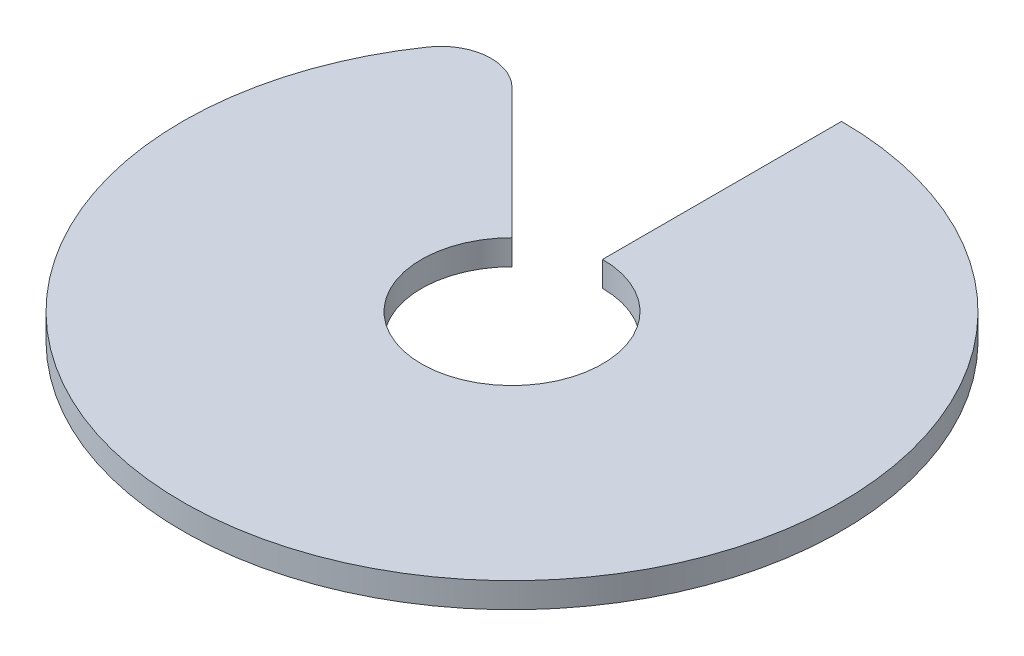
ISO-10303-21;
HEADER;
FILE_DESCRIPTION(('STEP AP214'),'2;1');
FILE_NAME('part.step','',(''),(''),'','','');
FILE_SCHEMA(('AUTOMOTIVE_DESIGN { 1 0 10303 214 1 1 1 1 }'));
ENDSEC;
DATA;
#1=APPLICATION_CONTEXT('core data for automotive mechanical design processes');
#2=APPLICATION_PROTOCOL_DEFINITION('international standard','automotive_design',2000,#1);
#3=PRODUCT_CONTEXT('',#1,'mechanical');
#4=PRODUCT('Part','Part','',(#3));
#5=PRODUCT_RELATED_PRODUCT_CATEGORY('part','',(#4));
#6=PRODUCT_DEFINITION_FORMATION('','',#4);
#7=PRODUCT_DEFINITION_CONTEXT('part definition',#1,'design');
#8=PRODUCT_DEFINITION('design','',#6,#7);
#9=PRODUCT_DEFINITION_SHAPE('','',#8);
#10=(LENGTH_UNIT() NAMED_UNIT(*) SI_UNIT(.MILLI.,.METRE.));
#11=(NAMED_UNIT(*) PLANE_ANGLE_UNIT() SI_UNIT($,.RADIAN.));
#12=(NAMED_UNIT(*) SI_UNIT($,.STERADIAN.) SOLID_ANGLE_UNIT());
#13=UNCERTAINTY_MEASURE_WITH_UNIT(LENGTH_MEASURE(1.E-05),#10,'distance_accuracy_value','');
#14=(GEOMETRIC_REPRESENTATION_CONTEXT(3) GLOBAL_UNCERTAINTY_ASSIGNED_CONTEXT((#13)) GLOBAL_UNIT_ASSIGNED_CONTEXT((#10,
#11,#12)) REPRESENTATION_CONTEXT('',''));
#15=CARTESIAN_POINT('',(0.,0.,0.));
#16=DIRECTION('',(0.,0.,1.));
#17=DIRECTION('',(1.,0.,0.));
#18=AXIS2_PLACEMENT_3D('',#15,#16,#17);
#19=CARTESIAN_POINT('',(-12.7279220613579,5.,-12.7279220613578));
#20=DIRECTION('',(-0.707106781186544,0.,0.707106781186551));
#21=DIRECTION('',(0.707106781186551,0.,0.707106781186544));
#22=AXIS2_PLACEMENT_3D('',#19,#20,#21);
#23=PLANE('',#22);
#24=DIRECTION('',(-0.707106781186551,0.,-0.707106781186544));
#25=VECTOR('',#24,1.);
#26=CARTESIAN_POINT('',(-12.7279220613579,0.,-12.7279220613578));
#27=LINE('',#26,#25);
#28=CARTESIAN_POINT('',(-12.7279220613579,0.,-12.7279220613578));
#29=VERTEX_POINT('',#28);
#30=CARTESIAN_POINT('',(-38.602137246531,0.,-38.6021372465306));
#31=VERTEX_POINT('',#30);
#32=EDGE_CURVE('E117',#29,#31,#27,.T.);
#33=ORIENTED_EDGE('',*,*,#32,.T.);
#34=DIRECTION('',(0.,-1.,0.));
#35=VECTOR('',#34,1.);
#36=CARTESIAN_POINT('',(-38.602137246531,5.,-38.6021372465306));
#37=LINE('',#36,#35);
#38=CARTESIAN_POINT('',(-38.602137246531,5.,-38.6021372465306));
#39=VERTEX_POINT('',#38);
#40=EDGE_CURVE('E47',#31,#39,#37,.F.);
#41=ORIENTED_EDGE('',*,*,#40,.T.);
#42=DIRECTION('',(-0.707106781186551,0.,-0.707106781186544));
#43=VECTOR('',#42,1.);
#44=CARTESIAN_POINT('',(-12.7279220613579,5.,-12.7279220613578));
#45=LINE('',#44,#43);
#46=CARTESIAN_POINT('',(-12.7279220613579,5.,-12.7279220613578));
#47=VERTEX_POINT('',#46);
#48=EDGE_CURVE('E100',#47,#39,#45,.T.);
#49=ORIENTED_EDGE('',*,*,#48,.F.);
#50=DIRECTION('',(0.,-1.,0.));
#51=VECTOR('',#50,1.);
#52=CARTESIAN_POINT('',(-12.7279220613579,5.,-12.7279220613578));
#53=LINE('',#52,#51);
#54=EDGE_CURVE('E112',#47,#29,#53,.T.);
#55=ORIENTED_EDGE('',*,*,#54,.T.);
#56=EDGE_LOOP('',(#33,#41,#49,#55));
#57=FACE_BOUND('',#56,.T.);
#58=ADVANCED_FACE('F41',(#57),#23,.F.);
#59=CARTESIAN_POINT('',(0.,5.,0.));
#60=DIRECTION('',(0.,-1.,0.));
#61=DIRECTION('',(0.,0.,-1.));
#62=AXIS2_PLACEMENT_3D('',#59,#60,#61);
#63=CYLINDRICAL_SURFACE('',#62,65.5);
#64=CARTESIAN_POINT('',(0.,5.,0.));
#65=DIRECTION('',(0.,1.,0.));
#66=DIRECTION('',(0.,0.,1.));
#67=AXIS2_PLACEMENT_3D('',#64,#65,#66);
#68=CIRCLE('',#67,65.5);
#69=CARTESIAN_POINT('',(-53.9026113752246,5.,-37.2123432066768));
#70=VERTEX_POINT('',#69);
#71=CARTESIAN_POINT('',(0.,5.,-65.5));
#72=VERTEX_POINT('',#71);
#73=EDGE_CURVE('E86',#70,#72,#68,.T.);
#74=ORIENTED_EDGE('',*,*,#73,.F.);
#75=DIRECTION('',(0.,-1.,0.));
#76=VECTOR('',#75,1.);
#77=CARTESIAN_POINT('',(-53.9026113752246,5.,-37.2123432066768));
#78=LINE('',#77,#76);
#79=CARTESIAN_POINT('',(-53.9026113752246,0.,-37.2123432066768));
#80=VERTEX_POINT('',#79);
#81=EDGE_CURVE('E108',#70,#80,#78,.T.);
#82=ORIENTED_EDGE('',*,*,#81,.T.);
#83=CARTESIAN_POINT('',(0.,0.,0.));
#84=DIRECTION('',(0.,1.,0.));
#85=DIRECTION('',(0.,0.,1.));
#86=AXIS2_PLACEMENT_3D('',#83,#84,#85);
#87=CIRCLE('',#86,65.5);
#88=CARTESIAN_POINT('',(0.,0.,-65.5));
#89=VERTEX_POINT('',#88);
#90=EDGE_CURVE('E104',#80,#89,#87,.T.);
#91=ORIENTED_EDGE('',*,*,#90,.T.);
#92=DIRECTION('',(0.,-1.,0.));
#93=VECTOR('',#92,1.);
#94=CARTESIAN_POINT('',(0.,5.,-65.5));
#95=LINE('',#94,#93);
#96=EDGE_CURVE('E105',#72,#89,#95,.T.);
#97=ORIENTED_EDGE('',*,*,#96,.F.);
#98=EDGE_LOOP('',(#74,#82,#91,#97));
#99=FACE_BOUND('',#98,.T.);
#100=ADVANCED_FACE('F101',(#99),#63,.T.);
#101=CARTESIAN_POINT('',(0.,5.,-18.));
#102=DIRECTION('',(-1.,0.,0.));
#103=DIRECTION('',(0.,0.,1.));
#104=AXIS2_PLACEMENT_3D('',#101,#102,#103);
#105=PLANE('',#104);
#106=DIRECTION('',(0.,0.,-1.));
#107=VECTOR('',#106,1.);
#108=CARTESIAN_POINT('',(0.,0.,-18.));
#109=LINE('',#108,#107);
#110=CARTESIAN_POINT('',(0.,0.,-18.));
#111=VERTEX_POINT('',#110);
#112=EDGE_CURVE('E122',#111,#89,#109,.T.);
#113=ORIENTED_EDGE('',*,*,#112,.F.);
#114=DIRECTION('',(0.,-1.,0.));
#115=VECTOR('',#114,1.);
#116=CARTESIAN_POINT('',(0.,5.,-18.));
#117=LINE('',#116,#115);
#118=CARTESIAN_POINT('',(0.,5.,-18.));
#119=VERTEX_POINT('',#118);
#120=EDGE_CURVE('E107',#119,#111,#117,.T.);
#121=ORIENTED_EDGE('',*,*,#120,.F.);
#122=DIRECTION('',(0.,0.,-1.));
#123=VECTOR('',#122,1.);
#124=CARTESIAN_POINT('',(0.,5.,-18.));
#125=LINE('',#124,#123);
#126=EDGE_CURVE('E92',#119,#72,#125,.T.);
#127=ORIENTED_EDGE('',*,*,#126,.T.);
#128=ORIENTED_EDGE('',*,*,#96,.T.);
#129=EDGE_LOOP('',(#113,#121,#127,#128));
#130=FACE_BOUND('',#129,.T.);
#131=ADVANCED_FACE('F111',(#130),#105,.T.);
#132=CARTESIAN_POINT('',(0.,5.,0.));
#133=DIRECTION('',(0.,-1.,0.));
#134=DIRECTION('',(0.,0.,-1.));
#135=AXIS2_PLACEMENT_3D('',#132,#133,#134);
#136=CYLINDRICAL_SURFACE('',#135,18.);
#137=CARTESIAN_POINT('',(0.,0.,0.));
#138=DIRECTION('',(0.,1.,0.));
#139=DIRECTION('',(0.,0.,1.));
#140=AXIS2_PLACEMENT_3D('',#137,#138,#139);
#141=CIRCLE('',#140,18.);
#142=EDGE_CURVE('E124',#29,#111,#141,.T.);
#143=ORIENTED_EDGE('',*,*,#142,.F.);
#144=ORIENTED_EDGE('',*,*,#54,.F.);
#145=CARTESIAN_POINT('',(0.,5.,0.));
#146=DIRECTION('',(0.,1.,0.));
#147=DIRECTION('',(0.,0.,1.));
#148=AXIS2_PLACEMENT_3D('',#145,#146,#147);
#149=CIRCLE('',#148,18.);
#150=EDGE_CURVE('E115',#47,#119,#149,.T.);
#151=ORIENTED_EDGE('',*,*,#150,.T.);
#152=ORIENTED_EDGE('',*,*,#120,.T.);
#153=EDGE_LOOP('',(#143,#144,#151,#152));
#154=FACE_BOUND('',#153,.T.);
#155=ADVANCED_FACE('F131',(#154),#136,.F.);
#156=CARTESIAN_POINT('',(0.,5.,0.));
#157=DIRECTION('',(0.,1.,0.));
#158=DIRECTION('',(0.,0.,1.));
#159=AXIS2_PLACEMENT_3D('',#156,#157,#158);
#160=PLANE('',#159);
#161=ORIENTED_EDGE('',*,*,#48,.T.);
#162=CARTESIAN_POINT('',(-45.6732050583964,5.,-31.531069434665));
#163=DIRECTION('',(0.,1.,0.));
#164=DIRECTION('',(0.,0.,1.));
#165=AXIS2_PLACEMENT_3D('',#162,#163,#164);
#166=CIRCLE('',#165,10.);
#167=EDGE_CURVE('E11',#39,#70,#166,.T.);
#168=ORIENTED_EDGE('',*,*,#167,.T.);
#169=ORIENTED_EDGE('',*,*,#73,.T.);
#170=ORIENTED_EDGE('',*,*,#126,.F.);
#171=ORIENTED_EDGE('',*,*,#150,.F.);
#172=EDGE_LOOP('',(#161,#168,#169,#170,#171));
#173=FACE_BOUND('',#172,.T.);
#174=ADVANCED_FACE('F87',(#173),#160,.T.);
#175=CARTESIAN_POINT('',(0.,0.,0.));
#176=DIRECTION('',(0.,1.,0.));
#177=DIRECTION('',(0.,0.,1.));
#178=AXIS2_PLACEMENT_3D('',#175,#176,#177);
#179=PLANE('',#178);
#180=ORIENTED_EDGE('',*,*,#90,.F.);
#181=CARTESIAN_POINT('',(-45.6732050583964,0.,-31.531069434665));
#182=DIRECTION('',(0.,1.,0.));
#183=DIRECTION('',(0.,0.,1.));
#184=AXIS2_PLACEMENT_3D('',#181,#182,#183);
#185=CIRCLE('',#184,10.);
#186=EDGE_CURVE('E64',#80,#31,#185,.F.);
#187=ORIENTED_EDGE('',*,*,#186,.T.);
#188=ORIENTED_EDGE('',*,*,#32,.F.);
#189=ORIENTED_EDGE('',*,*,#142,.T.);
#190=ORIENTED_EDGE('',*,*,#112,.T.);
#191=EDGE_LOOP('',(#180,#187,#188,#189,#190));
#192=FACE_BOUND('',#191,.T.);
#193=ADVANCED_FACE('F128',(#192),#179,.F.);
#194=CARTESIAN_POINT('',(-45.6732050583964,5.,-31.531069434665));
#195=DIRECTION('',(0.,-1.,0.));
#196=DIRECTION('',(0.,0.,-1.));
#197=AXIS2_PLACEMENT_3D('',#194,#195,#196);
#198=CYLINDRICAL_SURFACE('',#197,10.);
#199=ORIENTED_EDGE('',*,*,#167,.F.);
#200=ORIENTED_EDGE('',*,*,#40,.F.);
#201=ORIENTED_EDGE('',*,*,#186,.F.);
#202=ORIENTED_EDGE('',*,*,#81,.F.);
#203=EDGE_LOOP('',(#199,#200,#201,#202));
#204=FACE_BOUND('',#203,.T.);
#205=ADVANCED_FACE('F43',(#204),#198,.T.);
#206=CLOSED_SHELL('',(#58,#100,#131,#155,#174,#193,#205));
#207=MANIFOLD_SOLID_BREP('B2',#206);
#208=ADVANCED_BREP_SHAPE_REPRESENTATION('',(#18,#207),#14);
#209=SHAPE_DEFINITION_REPRESENTATION(#9,#208);
ENDSEC;
END-ISO-10303-21;
